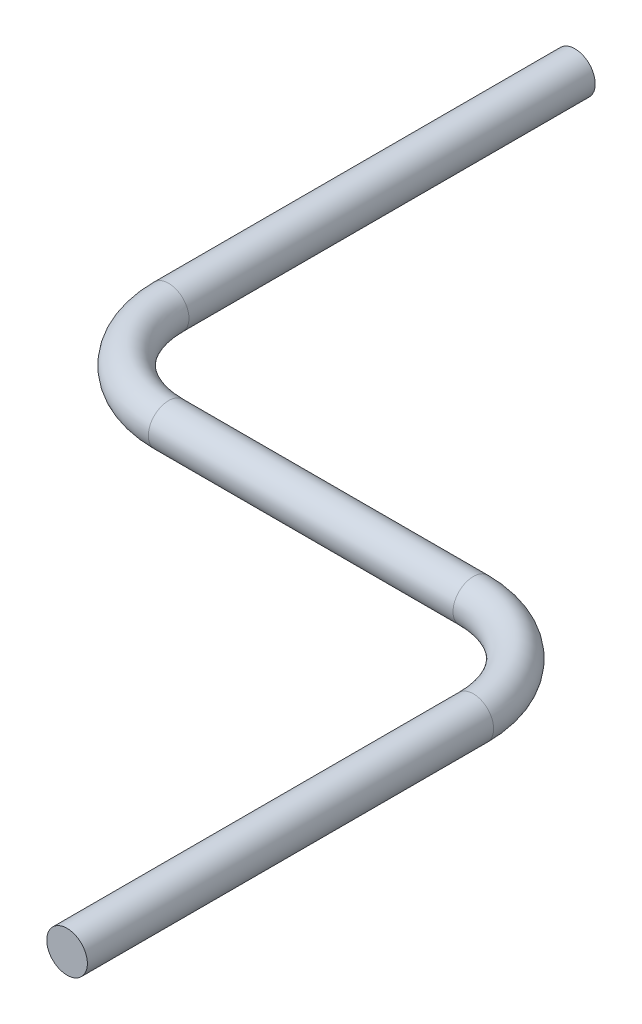
ISO-10303-21;
HEADER;
FILE_DESCRIPTION(('STEP AP214'),'2;1');
FILE_NAME('part.step','',(''),(''),'','','');
FILE_SCHEMA(('AUTOMOTIVE_DESIGN { 1 0 10303 214 1 1 1 1 }'));
ENDSEC;
DATA;
#1=APPLICATION_CONTEXT('core data for automotive mechanical design processes');
#2=APPLICATION_PROTOCOL_DEFINITION('international standard','automotive_design',2000,#1);
#3=PRODUCT_CONTEXT('',#1,'mechanical');
#4=PRODUCT('Part','Part','',(#3));
#5=PRODUCT_RELATED_PRODUCT_CATEGORY('part','',(#4));
#6=PRODUCT_DEFINITION_FORMATION('','',#4);
#7=PRODUCT_DEFINITION_CONTEXT('part definition',#1,'design');
#8=PRODUCT_DEFINITION('design','',#6,#7);
#9=PRODUCT_DEFINITION_SHAPE('','',#8);
#10=(LENGTH_UNIT() NAMED_UNIT(*) SI_UNIT(.MILLI.,.METRE.));
#11=(NAMED_UNIT(*) PLANE_ANGLE_UNIT() SI_UNIT($,.RADIAN.));
#12=(NAMED_UNIT(*) SI_UNIT($,.STERADIAN.) SOLID_ANGLE_UNIT());
#13=UNCERTAINTY_MEASURE_WITH_UNIT(LENGTH_MEASURE(1.E-05),#10,'distance_accuracy_value','');
#14=(GEOMETRIC_REPRESENTATION_CONTEXT(3) GLOBAL_UNCERTAINTY_ASSIGNED_CONTEXT((#13)) GLOBAL_UNIT_ASSIGNED_CONTEXT((#10,
#11,#12)) REPRESENTATION_CONTEXT('',''));
#15=CARTESIAN_POINT('',(0.,0.,0.));
#16=DIRECTION('',(0.,0.,1.));
#17=DIRECTION('',(1.,0.,0.));
#18=AXIS2_PLACEMENT_3D('',#15,#16,#17);
#19=CARTESIAN_POINT('',(0.,0.,0.));
#20=DIRECTION('',(0.,0.,1.));
#21=DIRECTION('',(1.,0.,0.));
#22=AXIS2_PLACEMENT_3D('',#19,#20,#21);
#23=PLANE('',#22);
#24=CARTESIAN_POINT('',(0.,0.,0.));
#25=DIRECTION('',(0.,0.,1.));
#26=DIRECTION('',(1.,0.,0.));
#27=AXIS2_PLACEMENT_3D('',#24,#25,#26);
#28=CIRCLE('',#27,2.);
#29=CARTESIAN_POINT('',(2.,0.,0.));
#30=VERTEX_POINT('',#29);
#31=EDGE_CURVE('E66',#30,#30,#28,.T.);
#32=ORIENTED_EDGE('',*,*,#31,.F.);
#33=EDGE_LOOP('',(#32));
#34=FACE_BOUND('',#33,.T.);
#35=ADVANCED_FACE('F39',(#34),#23,.F.);
#36=CARTESIAN_POINT('',(50.,0.,99.9999999999999));
#37=DIRECTION('',(0.,0.,1.));
#38=DIRECTION('',(1.,0.,0.));
#39=AXIS2_PLACEMENT_3D('',#36,#37,#38);
#40=PLANE('',#39);
#41=CARTESIAN_POINT('',(50.,0.,99.9999999999999));
#42=DIRECTION('',(0.,0.,1.));
#43=DIRECTION('',(1.,0.,0.));
#44=AXIS2_PLACEMENT_3D('',#41,#42,#43);
#45=CIRCLE('',#44,2.);
#46=CARTESIAN_POINT('',(52.,0.,99.9999999999999));
#47=VERTEX_POINT('',#46);
#48=EDGE_CURVE('E10',#47,#47,#45,.T.);
#49=ORIENTED_EDGE('',*,*,#48,.T.);
#50=EDGE_LOOP('',(#49));
#51=FACE_BOUND('',#50,.T.);
#52=ADVANCED_FACE('F74',(#51),#40,.T.);
#53=CARTESIAN_POINT('',(0.,0.,0.));
#54=DIRECTION('',(0.,0.,1.));
#55=DIRECTION('',(1.,0.,0.));
#56=AXIS2_PLACEMENT_3D('',#53,#54,#55);
#57=CYLINDRICAL_SURFACE('',#56,2.);
#58=CARTESIAN_POINT('',(0.,0.,39.9999999999999));
#59=DIRECTION('',(0.,0.,1.));
#60=DIRECTION('',(1.,0.,0.));
#61=AXIS2_PLACEMENT_3D('',#58,#59,#60);
#62=CIRCLE('',#61,2.);
#63=CARTESIAN_POINT('',(-2.,0.,39.9999999999999));
#64=VERTEX_POINT('',#63);
#65=EDGE_CURVE('E62',#64,#64,#62,.T.);
#66=ORIENTED_EDGE('',*,*,#65,.F.);
#67=EDGE_LOOP('',(#66));
#68=FACE_BOUND('',#67,.T.);
#69=ORIENTED_EDGE('',*,*,#31,.T.);
#70=EDGE_LOOP('',(#69));
#71=FACE_BOUND('',#70,.T.);
#72=ADVANCED_FACE('F71',(#68,#71),#57,.T.);
#73=CARTESIAN_POINT('',(10.,0.,40.));
#74=DIRECTION('',(0.,1.,0.));
#75=DIRECTION('',(0.,0.,1.));
#76=AXIS2_PLACEMENT_3D('',#73,#74,#75);
#77=TOROIDAL_SURFACE('',#76,10.,2.);
#78=CARTESIAN_POINT('',(10.,0.,50.));
#79=DIRECTION('',(1.,0.,0.));
#80=DIRECTION('',(0.,0.,-1.));
#81=AXIS2_PLACEMENT_3D('',#78,#79,#80);
#82=CIRCLE('',#81,2.);
#83=CARTESIAN_POINT('',(10.,0.,52.));
#84=VERTEX_POINT('',#83);
#85=EDGE_CURVE('E56',#84,#84,#82,.T.);
#86=CARTESIAN_POINT('',(10.,0.,40.));
#87=DIRECTION('',(0.,1.,0.));
#88=DIRECTION('',(0.,0.,1.));
#89=AXIS2_PLACEMENT_3D('',#86,#87,#88);
#90=CIRCLE('',#89,12.);
#91=EDGE_CURVE('',#64,#84,#90,.T.);
#92=ORIENTED_EDGE('',*,*,#65,.T.);
#93=ORIENTED_EDGE('',*,*,#85,.F.);
#94=ORIENTED_EDGE('',*,*,#91,.T.);
#95=ORIENTED_EDGE('',*,*,#91,.F.);
#96=EDGE_LOOP('',(#92,#94,#93,#95));
#97=FACE_BOUND('',#96,.T.);
#98=ADVANCED_FACE('F92',(#97),#77,.T.);
#99=CARTESIAN_POINT('',(10.,0.,50.));
#100=DIRECTION('',(1.,0.,0.));
#101=DIRECTION('',(0.,0.,-1.));
#102=AXIS2_PLACEMENT_3D('',#99,#100,#101);
#103=CYLINDRICAL_SURFACE('',#102,2.);
#104=CARTESIAN_POINT('',(40.,0.,49.9999999999999));
#105=DIRECTION('',(1.,0.,0.));
#106=DIRECTION('',(0.,0.,-1.));
#107=AXIS2_PLACEMENT_3D('',#104,#105,#106);
#108=CIRCLE('',#107,2.);
#109=CARTESIAN_POINT('',(40.,0.,47.9999999999999));
#110=VERTEX_POINT('',#109);
#111=EDGE_CURVE('E51',#110,#110,#108,.T.);
#112=ORIENTED_EDGE('',*,*,#111,.F.);
#113=EDGE_LOOP('',(#112));
#114=FACE_BOUND('',#113,.T.);
#115=ORIENTED_EDGE('',*,*,#85,.T.);
#116=EDGE_LOOP('',(#115));
#117=FACE_BOUND('',#116,.T.);
#118=ADVANCED_FACE('F86',(#114,#117),#103,.T.);
#119=CARTESIAN_POINT('',(40.,0.,59.9999999999999));
#120=DIRECTION('',(0.,-1.,0.));
#121=DIRECTION('',(0.,0.,-1.));
#122=AXIS2_PLACEMENT_3D('',#119,#120,#121);
#123=TOROIDAL_SURFACE('',#122,10.,2.);
#124=CARTESIAN_POINT('',(50.,0.,59.9999999999999));
#125=DIRECTION('',(0.,0.,1.));
#126=DIRECTION('',(1.,0.,0.));
#127=AXIS2_PLACEMENT_3D('',#124,#125,#126);
#128=CIRCLE('',#127,2.);
#129=CARTESIAN_POINT('',(52.,0.,59.9999999999999));
#130=VERTEX_POINT('',#129);
#131=EDGE_CURVE('E46',#130,#130,#128,.T.);
#132=CARTESIAN_POINT('',(40.,0.,59.9999999999999));
#133=DIRECTION('',(0.,-1.,0.));
#134=DIRECTION('',(0.,0.,-1.));
#135=AXIS2_PLACEMENT_3D('',#132,#133,#134);
#136=CIRCLE('',#135,12.);
#137=EDGE_CURVE('',#110,#130,#136,.T.);
#138=ORIENTED_EDGE('',*,*,#111,.T.);
#139=ORIENTED_EDGE('',*,*,#131,.F.);
#140=ORIENTED_EDGE('',*,*,#137,.T.);
#141=ORIENTED_EDGE('',*,*,#137,.F.);
#142=EDGE_LOOP('',(#138,#140,#139,#141));
#143=FACE_BOUND('',#142,.T.);
#144=ADVANCED_FACE('F80',(#143),#123,.T.);
#145=CARTESIAN_POINT('',(50.,0.,59.9999999999999));
#146=DIRECTION('',(0.,0.,1.));
#147=DIRECTION('',(1.,0.,0.));
#148=AXIS2_PLACEMENT_3D('',#145,#146,#147);
#149=CYLINDRICAL_SURFACE('',#148,2.);
#150=ORIENTED_EDGE('',*,*,#48,.F.);
#151=EDGE_LOOP('',(#150));
#152=FACE_BOUND('',#151,.T.);
#153=ORIENTED_EDGE('',*,*,#131,.T.);
#154=EDGE_LOOP('',(#153));
#155=FACE_BOUND('',#154,.T.);
#156=ADVANCED_FACE('F78',(#152,#155),#149,.T.);
#157=CLOSED_SHELL('',(#35,#52,#72,#98,#118,#144,#156));
#158=MANIFOLD_SOLID_BREP('B2',#157);
#159=ADVANCED_BREP_SHAPE_REPRESENTATION('',(#18,#158),#14);
#160=SHAPE_DEFINITION_REPRESENTATION(#9,#159);
ENDSEC;
END-ISO-10303-21;
